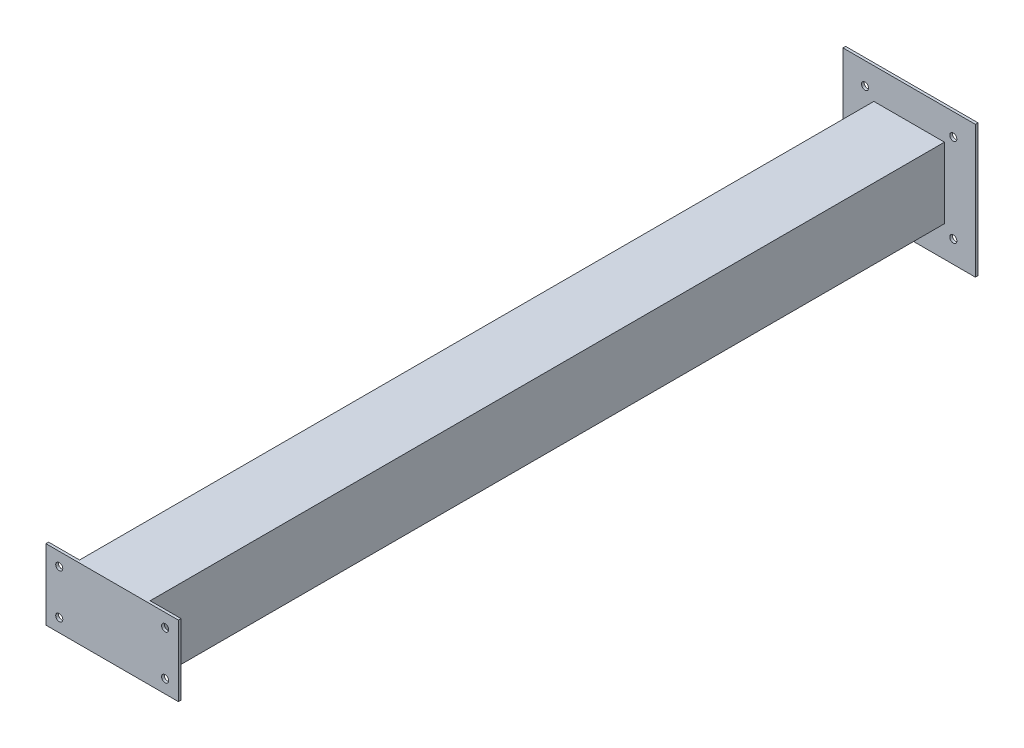
ISO-10303-21;
HEADER;
FILE_DESCRIPTION(('STEP AP214'),'2;1');
FILE_NAME('part.step','',(''),(''),'','','');
FILE_SCHEMA(('AUTOMOTIVE_DESIGN { 1 0 10303 214 1 1 1 1 }'));
ENDSEC;
DATA;
#1=APPLICATION_CONTEXT('core data for automotive mechanical design processes');
#2=APPLICATION_PROTOCOL_DEFINITION('international standard','automotive_design',2000,#1);
#3=PRODUCT_CONTEXT('',#1,'mechanical');
#4=PRODUCT('Part','Part','',(#3));
#5=PRODUCT_RELATED_PRODUCT_CATEGORY('part','',(#4));
#6=PRODUCT_DEFINITION_FORMATION('','',#4);
#7=PRODUCT_DEFINITION_CONTEXT('part definition',#1,'design');
#8=PRODUCT_DEFINITION('design','',#6,#7);
#9=PRODUCT_DEFINITION_SHAPE('','',#8);
#10=(LENGTH_UNIT() NAMED_UNIT(*) SI_UNIT(.MILLI.,.METRE.));
#11=(NAMED_UNIT(*) PLANE_ANGLE_UNIT() SI_UNIT($,.RADIAN.));
#12=(NAMED_UNIT(*) SI_UNIT($,.STERADIAN.) SOLID_ANGLE_UNIT());
#13=UNCERTAINTY_MEASURE_WITH_UNIT(LENGTH_MEASURE(1.E-05),#10,'distance_accuracy_value','');
#14=(GEOMETRIC_REPRESENTATION_CONTEXT(3) GLOBAL_UNCERTAINTY_ASSIGNED_CONTEXT((#13)) GLOBAL_UNIT_ASSIGNED_CONTEXT((#10,
#11,#12)) REPRESENTATION_CONTEXT('',''));
#15=CARTESIAN_POINT('',(0.,0.,0.));
#16=DIRECTION('',(0.,0.,1.));
#17=DIRECTION('',(1.,0.,0.));
#18=AXIS2_PLACEMENT_3D('',#15,#16,#17);
#19=CARTESIAN_POINT('',(40.,40.,900.));
#20=DIRECTION('',(-1.,0.,0.));
#21=DIRECTION('',(0.,0.,1.));
#22=AXIS2_PLACEMENT_3D('',#19,#20,#21);
#23=PLANE('',#22);
#24=DIRECTION('',(0.,0.,-1.));
#25=VECTOR('',#24,1.);
#26=CARTESIAN_POINT('',(40.,1.5,865.));
#27=LINE('',#26,#25);
#28=CARTESIAN_POINT('',(40.,1.5,900.));
#29=VERTEX_POINT('',#28);
#30=CARTESIAN_POINT('',(40.,1.5,865.));
#31=VERTEX_POINT('',#30);
#32=EDGE_CURVE('E187',#29,#31,#27,.T.);
#33=ORIENTED_EDGE('',*,*,#32,.T.);
#34=DIRECTION('',(0.,-1.,0.));
#35=VECTOR('',#34,1.);
#36=CARTESIAN_POINT('',(40.,1.5,865.));
#37=LINE('',#36,#35);
#38=CARTESIAN_POINT('',(40.,-1.5,865.));
#39=VERTEX_POINT('',#38);
#40=EDGE_CURVE('E696',#31,#39,#37,.T.);
#41=ORIENTED_EDGE('',*,*,#40,.T.);
#42=DIRECTION('',(0.,0.,-1.));
#43=VECTOR('',#42,1.);
#44=CARTESIAN_POINT('',(40.,-1.5,865.));
#45=LINE('',#44,#43);
#46=CARTESIAN_POINT('',(40.,-1.5,900.));
#47=VERTEX_POINT('',#46);
#48=EDGE_CURVE('E257',#47,#39,#45,.T.);
#49=ORIENTED_EDGE('',*,*,#48,.F.);
#50=DIRECTION('',(0.,1.,0.));
#51=VECTOR('',#50,1.);
#52=CARTESIAN_POINT('',(40.,40.,900.));
#53=LINE('',#52,#51);
#54=CARTESIAN_POINT('',(40.,-40.,900.));
#55=VERTEX_POINT('',#54);
#56=EDGE_CURVE('E208',#55,#47,#53,.T.);
#57=ORIENTED_EDGE('',*,*,#56,.F.);
#58=DIRECTION('',(0.,0.,-1.));
#59=VECTOR('',#58,1.);
#60=CARTESIAN_POINT('',(40.,-40.,900.));
#61=LINE('',#60,#59);
#62=CARTESIAN_POINT('',(40.,-40.,0.));
#63=VERTEX_POINT('',#62);
#64=EDGE_CURVE('E223',#55,#63,#61,.T.);
#65=ORIENTED_EDGE('',*,*,#64,.T.);
#66=DIRECTION('',(0.,1.,0.));
#67=VECTOR('',#66,1.);
#68=CARTESIAN_POINT('',(40.,40.,0.));
#69=LINE('',#68,#67);
#70=CARTESIAN_POINT('',(40.,40.,0.));
#71=VERTEX_POINT('',#70);
#72=EDGE_CURVE('E224',#63,#71,#69,.T.);
#73=ORIENTED_EDGE('',*,*,#72,.T.);
#74=DIRECTION('',(0.,0.,-1.));
#75=VECTOR('',#74,1.);
#76=CARTESIAN_POINT('',(40.,40.,900.));
#77=LINE('',#76,#75);
#78=CARTESIAN_POINT('',(40.,40.,900.));
#79=VERTEX_POINT('',#78);
#80=EDGE_CURVE('E11',#79,#71,#77,.T.);
#81=ORIENTED_EDGE('',*,*,#80,.F.);
#82=EDGE_CURVE('E201',#29,#79,#53,.T.);
#83=ORIENTED_EDGE('',*,*,#82,.F.);
#84=EDGE_LOOP('',(#33,#41,#49,#57,#65,#73,#81,#83));
#85=FACE_BOUND('',#84,.T.);
#86=ADVANCED_FACE('F37',(#85),#23,.F.);
#87=CARTESIAN_POINT('',(0.,0.,900.));
#88=DIRECTION('',(0.,0.,1.));
#89=DIRECTION('',(1.,0.,0.));
#90=AXIS2_PLACEMENT_3D('',#87,#88,#89);
#91=PLANE('',#90);
#92=CARTESIAN_POINT('',(60.,25.,900.));
#93=DIRECTION('',(0.,0.,1.));
#94=DIRECTION('',(1.,0.,0.));
#95=AXIS2_PLACEMENT_3D('',#92,#93,#94);
#96=CIRCLE('',#95,4.00000000000001);
#97=CARTESIAN_POINT('',(64.,25.,900.));
#98=VERTEX_POINT('',#97);
#99=EDGE_CURVE('E726',#98,#98,#96,.F.);
#100=ORIENTED_EDGE('',*,*,#99,.F.);
#101=EDGE_LOOP('',(#100));
#102=FACE_BOUND('',#101,.T.);
#103=DIRECTION('',(-1.,0.,0.));
#104=VECTOR('',#103,1.);
#105=CARTESIAN_POINT('',(40.,1.5,900.));
#106=LINE('',#105,#104);
#107=CARTESIAN_POINT('',(75.,1.5,900.));
#108=VERTEX_POINT('',#107);
#109=EDGE_CURVE('E190',#108,#29,#106,.T.);
#110=ORIENTED_EDGE('',*,*,#109,.T.);
#111=ORIENTED_EDGE('',*,*,#82,.T.);
#112=DIRECTION('',(-1.,0.,0.));
#113=VECTOR('',#112,1.);
#114=CARTESIAN_POINT('',(75.,40.,900.));
#115=LINE('',#114,#113);
#116=CARTESIAN_POINT('',(75.,40.,900.));
#117=VERTEX_POINT('',#116);
#118=EDGE_CURVE('E276',#117,#79,#115,.T.);
#119=ORIENTED_EDGE('',*,*,#118,.F.);
#120=DIRECTION('',(0.,1.,0.));
#121=VECTOR('',#120,1.);
#122=CARTESIAN_POINT('',(75.,-40.,900.));
#123=LINE('',#122,#121);
#124=EDGE_CURVE('E203',#108,#117,#123,.T.);
#125=ORIENTED_EDGE('',*,*,#124,.F.);
#126=EDGE_LOOP('',(#110,#111,#119,#125));
#127=FACE_BOUND('',#126,.T.);
#128=ADVANCED_FACE('F199',(#102,#127),#91,.F.);
#129=CARTESIAN_POINT('',(-40.,40.,900.));
#130=DIRECTION('',(1.,0.,0.));
#131=DIRECTION('',(0.,1.,0.));
#132=AXIS2_PLACEMENT_3D('',#129,#130,#131);
#133=PLANE('',#132);
#134=DIRECTION('',(0.,0.,-1.));
#135=VECTOR('',#134,1.);
#136=CARTESIAN_POINT('',(-40.,1.5,865.));
#137=LINE('',#136,#135);
#138=CARTESIAN_POINT('',(-40.,1.5,900.));
#139=VERTEX_POINT('',#138);
#140=CARTESIAN_POINT('',(-40.,1.5,865.));
#141=VERTEX_POINT('',#140);
#142=EDGE_CURVE('E704',#139,#141,#137,.T.);
#143=ORIENTED_EDGE('',*,*,#142,.F.);
#144=DIRECTION('',(0.,-1.,0.));
#145=VECTOR('',#144,1.);
#146=CARTESIAN_POINT('',(-40.,40.,900.));
#147=LINE('',#146,#145);
#148=CARTESIAN_POINT('',(-40.,40.,900.));
#149=VERTEX_POINT('',#148);
#150=EDGE_CURVE('E220',#149,#139,#147,.T.);
#151=ORIENTED_EDGE('',*,*,#150,.F.);
#152=DIRECTION('',(0.,0.,-1.));
#153=VECTOR('',#152,1.);
#154=CARTESIAN_POINT('',(-40.,40.,900.));
#155=LINE('',#154,#153);
#156=CARTESIAN_POINT('',(-40.,40.,0.));
#157=VERTEX_POINT('',#156);
#158=EDGE_CURVE('E45',#149,#157,#155,.T.);
#159=ORIENTED_EDGE('',*,*,#158,.T.);
#160=DIRECTION('',(0.,-1.,0.));
#161=VECTOR('',#160,1.);
#162=CARTESIAN_POINT('',(-40.,40.,0.));
#163=LINE('',#162,#161);
#164=CARTESIAN_POINT('',(-40.,-40.,0.));
#165=VERTEX_POINT('',#164);
#166=EDGE_CURVE('E214',#157,#165,#163,.T.);
#167=ORIENTED_EDGE('',*,*,#166,.T.);
#168=DIRECTION('',(0.,0.,-1.));
#169=VECTOR('',#168,1.);
#170=CARTESIAN_POINT('',(-40.,-40.,900.));
#171=LINE('',#170,#169);
#172=CARTESIAN_POINT('',(-40.,-40.,900.));
#173=VERTEX_POINT('',#172);
#174=EDGE_CURVE('E234',#173,#165,#171,.T.);
#175=ORIENTED_EDGE('',*,*,#174,.F.);
#176=CARTESIAN_POINT('',(-40.,-1.5,900.));
#177=VERTEX_POINT('',#176);
#178=EDGE_CURVE('E212',#177,#173,#147,.T.);
#179=ORIENTED_EDGE('',*,*,#178,.F.);
#180=DIRECTION('',(0.,0.,-1.));
#181=VECTOR('',#180,1.);
#182=CARTESIAN_POINT('',(-40.,-1.5,865.));
#183=LINE('',#182,#181);
#184=CARTESIAN_POINT('',(-40.,-1.5,865.));
#185=VERTEX_POINT('',#184);
#186=EDGE_CURVE('E60',#177,#185,#183,.T.);
#187=ORIENTED_EDGE('',*,*,#186,.T.);
#188=DIRECTION('',(0.,-1.,0.));
#189=VECTOR('',#188,1.);
#190=CARTESIAN_POINT('',(-40.,1.5,865.));
#191=LINE('',#190,#189);
#192=EDGE_CURVE('E719',#141,#185,#191,.T.);
#193=ORIENTED_EDGE('',*,*,#192,.F.);
#194=EDGE_LOOP('',(#143,#151,#159,#167,#175,#179,#187,#193));
#195=FACE_BOUND('',#194,.T.);
#196=ADVANCED_FACE('F240',(#195),#133,.F.);
#197=CARTESIAN_POINT('',(-60.,25.,900.));
#198=DIRECTION('',(0.,0.,1.));
#199=DIRECTION('',(1.,0.,0.));
#200=AXIS2_PLACEMENT_3D('',#197,#198,#199);
#201=CIRCLE('',#200,4.00000000000001);
#202=CARTESIAN_POINT('',(-56.,25.,900.));
#203=VERTEX_POINT('',#202);
#204=EDGE_CURVE('E743',#203,#203,#201,.F.);
#205=ORIENTED_EDGE('',*,*,#204,.F.);
#206=EDGE_LOOP('',(#205));
#207=FACE_BOUND('',#206,.T.);
#208=DIRECTION('',(1.,0.,0.));
#209=VECTOR('',#208,1.);
#210=CARTESIAN_POINT('',(-40.,1.5,900.));
#211=LINE('',#210,#209);
#212=CARTESIAN_POINT('',(-75.,1.5,900.));
#213=VERTEX_POINT('',#212);
#214=EDGE_CURVE('E710',#213,#139,#211,.T.);
#215=ORIENTED_EDGE('',*,*,#214,.F.);
#216=DIRECTION('',(0.,-1.,0.));
#217=VECTOR('',#216,1.);
#218=CARTESIAN_POINT('',(-75.,-40.,900.));
#219=LINE('',#218,#217);
#220=CARTESIAN_POINT('',(-75.,40.,900.));
#221=VERTEX_POINT('',#220);
#222=EDGE_CURVE('E268',#221,#213,#219,.T.);
#223=ORIENTED_EDGE('',*,*,#222,.F.);
#224=EDGE_CURVE('E246',#149,#221,#115,.T.);
#225=ORIENTED_EDGE('',*,*,#224,.F.);
#226=ORIENTED_EDGE('',*,*,#150,.T.);
#227=EDGE_LOOP('',(#215,#223,#225,#226));
#228=FACE_BOUND('',#227,.T.);
#229=ADVANCED_FACE('F403',(#207,#228),#91,.F.);
#230=CARTESIAN_POINT('',(-40.,40.,900.));
#231=DIRECTION('',(0.,-1.,0.));
#232=DIRECTION('',(0.,0.,-1.));
#233=AXIS2_PLACEMENT_3D('',#230,#231,#232);
#234=PLANE('',#233);
#235=DIRECTION('',(-1.,0.,0.));
#236=VECTOR('',#235,1.);
#237=CARTESIAN_POINT('',(-40.,40.,0.));
#238=LINE('',#237,#236);
#239=EDGE_CURVE('E226',#71,#157,#238,.T.);
#240=ORIENTED_EDGE('',*,*,#239,.T.);
#241=ORIENTED_EDGE('',*,*,#158,.F.);
#242=ORIENTED_EDGE('',*,*,#224,.T.);
#243=DIRECTION('',(0.,0.,-1.));
#244=VECTOR('',#243,1.);
#245=CARTESIAN_POINT('',(-75.,40.,903.));
#246=LINE('',#245,#244);
#247=CARTESIAN_POINT('',(-75.,40.,903.));
#248=VERTEX_POINT('',#247);
#249=EDGE_CURVE('E279',#248,#221,#246,.T.);
#250=ORIENTED_EDGE('',*,*,#249,.F.);
#251=DIRECTION('',(-1.,0.,0.));
#252=VECTOR('',#251,1.);
#253=CARTESIAN_POINT('',(75.,40.,903.));
#254=LINE('',#253,#252);
#255=CARTESIAN_POINT('',(75.,40.,903.));
#256=VERTEX_POINT('',#255);
#257=EDGE_CURVE('E282',#256,#248,#254,.T.);
#258=ORIENTED_EDGE('',*,*,#257,.F.);
#259=DIRECTION('',(0.,0.,-1.));
#260=VECTOR('',#259,1.);
#261=CARTESIAN_POINT('',(75.,40.,903.));
#262=LINE('',#261,#260);
#263=EDGE_CURVE('E281',#256,#117,#262,.T.);
#264=ORIENTED_EDGE('',*,*,#263,.T.);
#265=ORIENTED_EDGE('',*,*,#118,.T.);
#266=ORIENTED_EDGE('',*,*,#80,.T.);
#267=EDGE_LOOP('',(#240,#241,#242,#250,#258,#264,#265,#266));
#268=FACE_BOUND('',#267,.T.);
#269=ADVANCED_FACE('F244',(#268),#234,.F.);
#270=CARTESIAN_POINT('',(-40.,-40.,900.));
#271=DIRECTION('',(0.,1.,0.));
#272=DIRECTION('',(0.,0.,1.));
#273=AXIS2_PLACEMENT_3D('',#270,#271,#272);
#274=PLANE('',#273);
#275=DIRECTION('',(1.,0.,0.));
#276=VECTOR('',#275,1.);
#277=CARTESIAN_POINT('',(-40.,-40.,0.));
#278=LINE('',#277,#276);
#279=EDGE_CURVE('E209',#165,#63,#278,.T.);
#280=ORIENTED_EDGE('',*,*,#279,.T.);
#281=ORIENTED_EDGE('',*,*,#64,.F.);
#282=DIRECTION('',(1.,0.,0.));
#283=VECTOR('',#282,1.);
#284=CARTESIAN_POINT('',(75.,-40.,900.));
#285=LINE('',#284,#283);
#286=CARTESIAN_POINT('',(75.,-40.,900.));
#287=VERTEX_POINT('',#286);
#288=EDGE_CURVE('E261',#55,#287,#285,.T.);
#289=ORIENTED_EDGE('',*,*,#288,.T.);
#290=DIRECTION('',(0.,0.,-1.));
#291=VECTOR('',#290,1.);
#292=CARTESIAN_POINT('',(75.,-40.,903.));
#293=LINE('',#292,#291);
#294=CARTESIAN_POINT('',(75.,-40.,903.));
#295=VERTEX_POINT('',#294);
#296=EDGE_CURVE('E285',#295,#287,#293,.T.);
#297=ORIENTED_EDGE('',*,*,#296,.F.);
#298=DIRECTION('',(1.,0.,0.));
#299=VECTOR('',#298,1.);
#300=CARTESIAN_POINT('',(75.,-40.,903.));
#301=LINE('',#300,#299);
#302=CARTESIAN_POINT('',(-75.,-40.,903.));
#303=VERTEX_POINT('',#302);
#304=EDGE_CURVE('E748',#303,#295,#301,.T.);
#305=ORIENTED_EDGE('',*,*,#304,.F.);
#306=DIRECTION('',(0.,0.,-1.));
#307=VECTOR('',#306,1.);
#308=CARTESIAN_POINT('',(-75.,-40.,903.));
#309=LINE('',#308,#307);
#310=CARTESIAN_POINT('',(-75.,-40.,900.));
#311=VERTEX_POINT('',#310);
#312=EDGE_CURVE('E287',#303,#311,#309,.T.);
#313=ORIENTED_EDGE('',*,*,#312,.T.);
#314=EDGE_CURVE('E267',#311,#173,#285,.T.);
#315=ORIENTED_EDGE('',*,*,#314,.T.);
#316=ORIENTED_EDGE('',*,*,#174,.T.);
#317=EDGE_LOOP('',(#280,#281,#289,#297,#305,#313,#315,#316));
#318=FACE_BOUND('',#317,.T.);
#319=ADVANCED_FACE('F252',(#318),#274,.F.);
#320=CARTESIAN_POINT('',(50.,-50.,-3.));
#321=DIRECTION('',(0.,0.,1.));
#322=DIRECTION('',(1.,0.,0.));
#323=AXIS2_PLACEMENT_3D('',#320,#321,#322);
#324=CYLINDRICAL_SURFACE('',#323,4.00000000000001);
#325=CARTESIAN_POINT('',(50.,-50.,-3.));
#326=DIRECTION('',(0.,0.,-1.));
#327=DIRECTION('',(-1.,0.,0.));
#328=AXIS2_PLACEMENT_3D('',#325,#326,#327);
#329=CIRCLE('',#328,4.00000000000001);
#330=CARTESIAN_POINT('',(46.,-50.,-3.));
#331=VERTEX_POINT('',#330);
#332=EDGE_CURVE('E291',#331,#331,#329,.T.);
#333=ORIENTED_EDGE('',*,*,#332,.T.);
#334=EDGE_LOOP('',(#333));
#335=FACE_BOUND('',#334,.T.);
#336=CARTESIAN_POINT('',(50.,-50.,0.));
#337=DIRECTION('',(0.,0.,-1.));
#338=DIRECTION('',(-1.,0.,0.));
#339=AXIS2_PLACEMENT_3D('',#336,#337,#338);
#340=CIRCLE('',#339,4.00000000000001);
#341=CARTESIAN_POINT('',(46.,-50.,0.));
#342=VERTEX_POINT('',#341);
#343=EDGE_CURVE('E290',#342,#342,#340,.T.);
#344=ORIENTED_EDGE('',*,*,#343,.F.);
#345=EDGE_LOOP('',(#344));
#346=FACE_BOUND('',#345,.T.);
#347=ADVANCED_FACE('F462',(#335,#346),#324,.F.);
#348=CARTESIAN_POINT('',(-50.,-50.,-3.));
#349=DIRECTION('',(0.,0.,1.));
#350=DIRECTION('',(1.,0.,0.));
#351=AXIS2_PLACEMENT_3D('',#348,#349,#350);
#352=CYLINDRICAL_SURFACE('',#351,4.);
#353=CARTESIAN_POINT('',(-50.,-50.,-3.));
#354=DIRECTION('',(0.,0.,-1.));
#355=DIRECTION('',(1.,0.,0.));
#356=AXIS2_PLACEMENT_3D('',#353,#354,#355);
#357=CIRCLE('',#356,4.);
#358=CARTESIAN_POINT('',(-46.,-50.,-3.));
#359=VERTEX_POINT('',#358);
#360=EDGE_CURVE('E297',#359,#359,#357,.T.);
#361=ORIENTED_EDGE('',*,*,#360,.T.);
#362=EDGE_LOOP('',(#361));
#363=FACE_BOUND('',#362,.T.);
#364=CARTESIAN_POINT('',(-50.,-50.,0.));
#365=DIRECTION('',(0.,0.,-1.));
#366=DIRECTION('',(1.,0.,0.));
#367=AXIS2_PLACEMENT_3D('',#364,#365,#366);
#368=CIRCLE('',#367,4.);
#369=CARTESIAN_POINT('',(-46.,-50.,0.));
#370=VERTEX_POINT('',#369);
#371=EDGE_CURVE('E294',#370,#370,#368,.T.);
#372=ORIENTED_EDGE('',*,*,#371,.F.);
#373=EDGE_LOOP('',(#372));
#374=FACE_BOUND('',#373,.T.);
#375=ADVANCED_FACE('F470',(#363,#374),#352,.F.);
#376=CARTESIAN_POINT('',(50.,50.,-3.));
#377=DIRECTION('',(0.,0.,1.));
#378=DIRECTION('',(1.,0.,0.));
#379=AXIS2_PLACEMENT_3D('',#376,#377,#378);
#380=CYLINDRICAL_SURFACE('',#379,4.);
#381=CARTESIAN_POINT('',(50.,50.,-3.));
#382=DIRECTION('',(0.,0.,-1.));
#383=DIRECTION('',(1.,0.,0.));
#384=AXIS2_PLACEMENT_3D('',#381,#382,#383);
#385=CIRCLE('',#384,4.);
#386=CARTESIAN_POINT('',(54.,50.,-3.));
#387=VERTEX_POINT('',#386);
#388=EDGE_CURVE('E303',#387,#387,#385,.T.);
#389=ORIENTED_EDGE('',*,*,#388,.T.);
#390=EDGE_LOOP('',(#389));
#391=FACE_BOUND('',#390,.T.);
#392=CARTESIAN_POINT('',(50.,50.,0.));
#393=DIRECTION('',(0.,0.,-1.));
#394=DIRECTION('',(1.,0.,0.));
#395=AXIS2_PLACEMENT_3D('',#392,#393,#394);
#396=CIRCLE('',#395,4.);
#397=CARTESIAN_POINT('',(54.,50.,0.));
#398=VERTEX_POINT('',#397);
#399=EDGE_CURVE('E300',#398,#398,#396,.T.);
#400=ORIENTED_EDGE('',*,*,#399,.F.);
#401=EDGE_LOOP('',(#400));
#402=FACE_BOUND('',#401,.T.);
#403=ADVANCED_FACE('F478',(#391,#402),#380,.F.);
#404=CARTESIAN_POINT('',(-50.,50.,-3.));
#405=DIRECTION('',(0.,0.,1.));
#406=DIRECTION('',(1.,0.,0.));
#407=AXIS2_PLACEMENT_3D('',#404,#405,#406);
#408=CYLINDRICAL_SURFACE('',#407,4.);
#409=CARTESIAN_POINT('',(-50.,50.,-3.));
#410=DIRECTION('',(0.,0.,-1.));
#411=DIRECTION('',(-1.,0.,0.));
#412=AXIS2_PLACEMENT_3D('',#409,#410,#411);
#413=CIRCLE('',#412,4.);
#414=CARTESIAN_POINT('',(-54.,50.,-3.));
#415=VERTEX_POINT('',#414);
#416=EDGE_CURVE('E309',#415,#415,#413,.T.);
#417=ORIENTED_EDGE('',*,*,#416,.T.);
#418=EDGE_LOOP('',(#417));
#419=FACE_BOUND('',#418,.T.);
#420=CARTESIAN_POINT('',(-50.,50.,0.));
#421=DIRECTION('',(0.,0.,-1.));
#422=DIRECTION('',(-1.,0.,0.));
#423=AXIS2_PLACEMENT_3D('',#420,#421,#422);
#424=CIRCLE('',#423,4.);
#425=CARTESIAN_POINT('',(-54.,50.,0.));
#426=VERTEX_POINT('',#425);
#427=EDGE_CURVE('E306',#426,#426,#424,.T.);
#428=ORIENTED_EDGE('',*,*,#427,.F.);
#429=EDGE_LOOP('',(#428));
#430=FACE_BOUND('',#429,.T.);
#431=ADVANCED_FACE('F486',(#419,#430),#408,.F.);
#432=CARTESIAN_POINT('',(-75.,75.,-3.));
#433=DIRECTION('',(0.,-1.,0.));
#434=DIRECTION('',(0.,0.,-1.));
#435=AXIS2_PLACEMENT_3D('',#432,#433,#434);
#436=PLANE('',#435);
#437=DIRECTION('',(1.,0.,0.));
#438=VECTOR('',#437,1.);
#439=CARTESIAN_POINT('',(-75.,75.,0.));
#440=LINE('',#439,#438);
#441=CARTESIAN_POINT('',(-75.,75.,0.));
#442=VERTEX_POINT('',#441);
#443=CARTESIAN_POINT('',(75.,75.,0.));
#444=VERTEX_POINT('',#443);
#445=EDGE_CURVE('E319',#442,#444,#440,.T.);
#446=ORIENTED_EDGE('',*,*,#445,.T.);
#447=DIRECTION('',(0.,0.,1.));
#448=VECTOR('',#447,1.);
#449=CARTESIAN_POINT('',(75.,75.,-3.));
#450=LINE('',#449,#448);
#451=CARTESIAN_POINT('',(75.,75.,-3.));
#452=VERTEX_POINT('',#451);
#453=EDGE_CURVE('E325',#452,#444,#450,.T.);
#454=ORIENTED_EDGE('',*,*,#453,.F.);
#455=DIRECTION('',(1.,0.,0.));
#456=VECTOR('',#455,1.);
#457=CARTESIAN_POINT('',(-75.,75.,-3.));
#458=LINE('',#457,#456);
#459=CARTESIAN_POINT('',(-75.,75.,-3.));
#460=VERTEX_POINT('',#459);
#461=EDGE_CURVE('E323',#460,#452,#458,.T.);
#462=ORIENTED_EDGE('',*,*,#461,.F.);
#463=DIRECTION('',(0.,0.,1.));
#464=VECTOR('',#463,1.);
#465=CARTESIAN_POINT('',(-75.,75.,-3.));
#466=LINE('',#465,#464);
#467=EDGE_CURVE('E335',#460,#442,#466,.T.);
#468=ORIENTED_EDGE('',*,*,#467,.T.);
#469=EDGE_LOOP('',(#446,#454,#462,#468));
#470=FACE_BOUND('',#469,.T.);
#471=ADVANCED_FACE('F494',(#470),#436,.F.);
#472=CARTESIAN_POINT('',(-75.,-75.,-3.));
#473=DIRECTION('',(1.,0.,0.));
#474=DIRECTION('',(0.,0.,-1.));
#475=AXIS2_PLACEMENT_3D('',#472,#473,#474);
#476=PLANE('',#475);
#477=DIRECTION('',(0.,1.,0.));
#478=VECTOR('',#477,1.);
#479=CARTESIAN_POINT('',(-75.,-75.,0.));
#480=LINE('',#479,#478);
#481=CARTESIAN_POINT('',(-75.,-75.,0.));
#482=VERTEX_POINT('',#481);
#483=EDGE_CURVE('E330',#482,#442,#480,.T.);
#484=ORIENTED_EDGE('',*,*,#483,.T.);
#485=ORIENTED_EDGE('',*,*,#467,.F.);
#486=DIRECTION('',(0.,1.,0.));
#487=VECTOR('',#486,1.);
#488=CARTESIAN_POINT('',(-75.,-75.,-3.));
#489=LINE('',#488,#487);
#490=CARTESIAN_POINT('',(-75.,-75.,-3.));
#491=VERTEX_POINT('',#490);
#492=EDGE_CURVE('E321',#491,#460,#489,.T.);
#493=ORIENTED_EDGE('',*,*,#492,.F.);
#494=DIRECTION('',(0.,0.,1.));
#495=VECTOR('',#494,1.);
#496=CARTESIAN_POINT('',(-75.,-75.,-3.));
#497=LINE('',#496,#495);
#498=EDGE_CURVE('E338',#491,#482,#497,.T.);
#499=ORIENTED_EDGE('',*,*,#498,.T.);
#500=EDGE_LOOP('',(#484,#485,#493,#499));
#501=FACE_BOUND('',#500,.T.);
#502=ADVANCED_FACE('F502',(#501),#476,.F.);
#503=CARTESIAN_POINT('',(-75.,-75.,-3.));
#504=DIRECTION('',(0.,1.,0.));
#505=DIRECTION('',(-1.,0.,0.));
#506=AXIS2_PLACEMENT_3D('',#503,#504,#505);
#507=PLANE('',#506);
#508=DIRECTION('',(-1.,0.,0.));
#509=VECTOR('',#508,1.);
#510=CARTESIAN_POINT('',(-75.,-75.,0.));
#511=LINE('',#510,#509);
#512=CARTESIAN_POINT('',(75.,-75.,0.));
#513=VERTEX_POINT('',#512);
#514=EDGE_CURVE('E328',#513,#482,#511,.T.);
#515=ORIENTED_EDGE('',*,*,#514,.T.);
#516=ORIENTED_EDGE('',*,*,#498,.F.);
#517=DIRECTION('',(-1.,0.,0.));
#518=VECTOR('',#517,1.);
#519=CARTESIAN_POINT('',(-75.,-75.,-3.));
#520=LINE('',#519,#518);
#521=CARTESIAN_POINT('',(75.,-75.,-3.));
#522=VERTEX_POINT('',#521);
#523=EDGE_CURVE('E318',#522,#491,#520,.T.);
#524=ORIENTED_EDGE('',*,*,#523,.F.);
#525=DIRECTION('',(0.,0.,1.));
#526=VECTOR('',#525,1.);
#527=CARTESIAN_POINT('',(75.,-75.,-3.));
#528=LINE('',#527,#526);
#529=EDGE_CURVE('E341',#522,#513,#528,.T.);
#530=ORIENTED_EDGE('',*,*,#529,.T.);
#531=EDGE_LOOP('',(#515,#516,#524,#530));
#532=FACE_BOUND('',#531,.T.);
#533=ADVANCED_FACE('F425',(#532),#507,.F.);
#534=CARTESIAN_POINT('',(75.,-75.,-3.));
#535=DIRECTION('',(-1.,0.,0.));
#536=DIRECTION('',(0.,0.,1.));
#537=AXIS2_PLACEMENT_3D('',#534,#535,#536);
#538=PLANE('',#537);
#539=DIRECTION('',(0.,-1.,0.));
#540=VECTOR('',#539,1.);
#541=CARTESIAN_POINT('',(75.,-75.,0.));
#542=LINE('',#541,#540);
#543=EDGE_CURVE('E312',#444,#513,#542,.T.);
#544=ORIENTED_EDGE('',*,*,#543,.T.);
#545=ORIENTED_EDGE('',*,*,#529,.F.);
#546=DIRECTION('',(0.,-1.,0.));
#547=VECTOR('',#546,1.);
#548=CARTESIAN_POINT('',(75.,-75.,-3.));
#549=LINE('',#548,#547);
#550=EDGE_CURVE('E315',#452,#522,#549,.T.);
#551=ORIENTED_EDGE('',*,*,#550,.F.);
#552=ORIENTED_EDGE('',*,*,#453,.T.);
#553=EDGE_LOOP('',(#544,#545,#551,#552));
#554=FACE_BOUND('',#553,.T.);
#555=ADVANCED_FACE('F418',(#554),#538,.F.);
#556=CARTESIAN_POINT('',(0.,0.,0.));
#557=DIRECTION('',(0.,0.,-1.));
#558=DIRECTION('',(-1.,0.,0.));
#559=AXIS2_PLACEMENT_3D('',#556,#557,#558);
#560=PLANE('',#559);
#561=ORIENTED_EDGE('',*,*,#72,.F.);
#562=ORIENTED_EDGE('',*,*,#279,.F.);
#563=ORIENTED_EDGE('',*,*,#166,.F.);
#564=ORIENTED_EDGE('',*,*,#239,.F.);
#565=EDGE_LOOP('',(#561,#562,#563,#564));
#566=FACE_BOUND('',#565,.T.);
#567=ORIENTED_EDGE('',*,*,#543,.F.);
#568=ORIENTED_EDGE('',*,*,#445,.F.);
#569=ORIENTED_EDGE('',*,*,#483,.F.);
#570=ORIENTED_EDGE('',*,*,#514,.F.);
#571=EDGE_LOOP('',(#567,#568,#569,#570));
#572=FACE_BOUND('',#571,.T.);
#573=ORIENTED_EDGE('',*,*,#427,.T.);
#574=EDGE_LOOP('',(#573));
#575=FACE_BOUND('',#574,.T.);
#576=ORIENTED_EDGE('',*,*,#399,.T.);
#577=EDGE_LOOP('',(#576));
#578=FACE_BOUND('',#577,.T.);
#579=ORIENTED_EDGE('',*,*,#371,.T.);
#580=EDGE_LOOP('',(#579));
#581=FACE_BOUND('',#580,.T.);
#582=ORIENTED_EDGE('',*,*,#343,.T.);
#583=EDGE_LOOP('',(#582));
#584=FACE_BOUND('',#583,.T.);
#585=ADVANCED_FACE('F249',(#566,#572,#575,#578,#581,#584),#560,.F.);
#586=CARTESIAN_POINT('',(0.,0.,-3.));
#587=DIRECTION('',(0.,0.,-1.));
#588=DIRECTION('',(-1.,0.,0.));
#589=AXIS2_PLACEMENT_3D('',#586,#587,#588);
#590=PLANE('',#589);
#591=ORIENTED_EDGE('',*,*,#360,.F.);
#592=EDGE_LOOP('',(#591));
#593=FACE_BOUND('',#592,.T.);
#594=ORIENTED_EDGE('',*,*,#416,.F.);
#595=EDGE_LOOP('',(#594));
#596=FACE_BOUND('',#595,.T.);
#597=ORIENTED_EDGE('',*,*,#550,.T.);
#598=ORIENTED_EDGE('',*,*,#523,.T.);
#599=ORIENTED_EDGE('',*,*,#492,.T.);
#600=ORIENTED_EDGE('',*,*,#461,.T.);
#601=EDGE_LOOP('',(#597,#598,#599,#600));
#602=FACE_BOUND('',#601,.T.);
#603=ORIENTED_EDGE('',*,*,#388,.F.);
#604=EDGE_LOOP('',(#603));
#605=FACE_BOUND('',#604,.T.);
#606=ORIENTED_EDGE('',*,*,#332,.F.);
#607=EDGE_LOOP('',(#606));
#608=FACE_BOUND('',#607,.T.);
#609=ADVANCED_FACE('F417',(#593,#596,#602,#605,#608),#590,.T.);
#610=CARTESIAN_POINT('',(0.,0.,903.));
#611=DIRECTION('',(0.,0.,1.));
#612=DIRECTION('',(1.,0.,0.));
#613=AXIS2_PLACEMENT_3D('',#610,#611,#612);
#614=PLANE('',#613);
#615=CARTESIAN_POINT('',(-60.,-25.,903.));
#616=DIRECTION('',(0.,0.,1.));
#617=DIRECTION('',(-1.,0.,0.));
#618=AXIS2_PLACEMENT_3D('',#615,#616,#617);
#619=CIRCLE('',#618,4.00000000000001);
#620=CARTESIAN_POINT('',(-64.,-25.,903.));
#621=VERTEX_POINT('',#620);
#622=EDGE_CURVE('E722',#621,#621,#619,.T.);
#623=ORIENTED_EDGE('',*,*,#622,.F.);
#624=EDGE_LOOP('',(#623));
#625=FACE_BOUND('',#624,.T.);
#626=CARTESIAN_POINT('',(60.,-25.,903.));
#627=DIRECTION('',(0.,0.,1.));
#628=DIRECTION('',(1.,0.,0.));
#629=AXIS2_PLACEMENT_3D('',#626,#627,#628);
#630=CIRCLE('',#629,4.00000000000001);
#631=CARTESIAN_POINT('',(64.,-25.,903.));
#632=VERTEX_POINT('',#631);
#633=EDGE_CURVE('E731',#632,#632,#630,.T.);
#634=ORIENTED_EDGE('',*,*,#633,.F.);
#635=EDGE_LOOP('',(#634));
#636=FACE_BOUND('',#635,.T.);
#637=CARTESIAN_POINT('',(60.,25.,903.));
#638=DIRECTION('',(0.,0.,1.));
#639=DIRECTION('',(-1.,0.,0.));
#640=AXIS2_PLACEMENT_3D('',#637,#638,#639);
#641=CIRCLE('',#640,4.00000000000001);
#642=CARTESIAN_POINT('',(56.,25.,903.));
#643=VERTEX_POINT('',#642);
#644=EDGE_CURVE('E723',#643,#643,#641,.T.);
#645=ORIENTED_EDGE('',*,*,#644,.F.);
#646=EDGE_LOOP('',(#645));
#647=FACE_BOUND('',#646,.T.);
#648=CARTESIAN_POINT('',(-60.,25.,903.));
#649=DIRECTION('',(0.,0.,1.));
#650=DIRECTION('',(1.,0.,0.));
#651=AXIS2_PLACEMENT_3D('',#648,#649,#650);
#652=CIRCLE('',#651,4.00000000000001);
#653=CARTESIAN_POINT('',(-56.,25.,903.));
#654=VERTEX_POINT('',#653);
#655=EDGE_CURVE('E730',#654,#654,#652,.T.);
#656=ORIENTED_EDGE('',*,*,#655,.F.);
#657=EDGE_LOOP('',(#656));
#658=FACE_BOUND('',#657,.T.);
#659=DIRECTION('',(0.,-1.,0.));
#660=VECTOR('',#659,1.);
#661=CARTESIAN_POINT('',(-75.,-40.,903.));
#662=LINE('',#661,#660);
#663=EDGE_CURVE('E278',#248,#303,#662,.T.);
#664=ORIENTED_EDGE('',*,*,#663,.T.);
#665=ORIENTED_EDGE('',*,*,#304,.T.);
#666=DIRECTION('',(0.,1.,0.));
#667=VECTOR('',#666,1.);
#668=CARTESIAN_POINT('',(75.,-40.,903.));
#669=LINE('',#668,#667);
#670=EDGE_CURVE('E750',#295,#256,#669,.T.);
#671=ORIENTED_EDGE('',*,*,#670,.T.);
#672=ORIENTED_EDGE('',*,*,#257,.T.);
#673=EDGE_LOOP('',(#664,#665,#671,#672));
#674=FACE_BOUND('',#673,.T.);
#675=ADVANCED_FACE('F423',(#625,#636,#647,#658,#674),#614,.T.);
#676=CARTESIAN_POINT('',(75.,-40.,903.));
#677=DIRECTION('',(-1.,0.,0.));
#678=DIRECTION('',(0.,0.,1.));
#679=AXIS2_PLACEMENT_3D('',#676,#677,#678);
#680=PLANE('',#679);
#681=CARTESIAN_POINT('',(75.,-1.5,900.));
#682=VERTEX_POINT('',#681);
#683=EDGE_CURVE('E264',#287,#682,#123,.T.);
#684=ORIENTED_EDGE('',*,*,#683,.T.);
#685=DIRECTION('',(0.,-1.,0.));
#686=VECTOR('',#685,1.);
#687=CARTESIAN_POINT('',(75.,1.5,900.));
#688=LINE('',#687,#686);
#689=EDGE_CURVE('E697',#108,#682,#688,.T.);
#690=ORIENTED_EDGE('',*,*,#689,.F.);
#691=ORIENTED_EDGE('',*,*,#124,.T.);
#692=ORIENTED_EDGE('',*,*,#263,.F.);
#693=ORIENTED_EDGE('',*,*,#670,.F.);
#694=ORIENTED_EDGE('',*,*,#296,.T.);
#695=EDGE_LOOP('',(#684,#690,#691,#692,#693,#694));
#696=FACE_BOUND('',#695,.T.);
#697=ADVANCED_FACE('F556',(#696),#680,.F.);
#698=CARTESIAN_POINT('',(-75.,-40.,903.));
#699=DIRECTION('',(1.,0.,0.));
#700=DIRECTION('',(0.,0.,-1.));
#701=AXIS2_PLACEMENT_3D('',#698,#699,#700);
#702=PLANE('',#701);
#703=ORIENTED_EDGE('',*,*,#222,.T.);
#704=DIRECTION('',(0.,-1.,0.));
#705=VECTOR('',#704,1.);
#706=CARTESIAN_POINT('',(-75.,1.5,900.));
#707=LINE('',#706,#705);
#708=CARTESIAN_POINT('',(-75.,-1.5,900.));
#709=VERTEX_POINT('',#708);
#710=EDGE_CURVE('E712',#213,#709,#707,.T.);
#711=ORIENTED_EDGE('',*,*,#710,.T.);
#712=EDGE_CURVE('E271',#709,#311,#219,.T.);
#713=ORIENTED_EDGE('',*,*,#712,.T.);
#714=ORIENTED_EDGE('',*,*,#312,.F.);
#715=ORIENTED_EDGE('',*,*,#663,.F.);
#716=ORIENTED_EDGE('',*,*,#249,.T.);
#717=EDGE_LOOP('',(#703,#711,#713,#714,#715,#716));
#718=FACE_BOUND('',#717,.T.);
#719=ADVANCED_FACE('F405',(#718),#702,.F.);
#720=CARTESIAN_POINT('',(-60.,-25.,900.));
#721=DIRECTION('',(0.,0.,1.));
#722=DIRECTION('',(1.,0.,0.));
#723=AXIS2_PLACEMENT_3D('',#720,#721,#722);
#724=CIRCLE('',#723,4.00000000000001);
#725=CARTESIAN_POINT('',(-56.,-25.,900.));
#726=VERTEX_POINT('',#725);
#727=EDGE_CURVE('E734',#726,#726,#724,.F.);
#728=ORIENTED_EDGE('',*,*,#727,.F.);
#729=EDGE_LOOP('',(#728));
#730=FACE_BOUND('',#729,.T.);
#731=ORIENTED_EDGE('',*,*,#712,.F.);
#732=DIRECTION('',(1.,0.,0.));
#733=VECTOR('',#732,1.);
#734=CARTESIAN_POINT('',(-40.,-1.5,900.));
#735=LINE('',#734,#733);
#736=EDGE_CURVE('E708',#709,#177,#735,.T.);
#737=ORIENTED_EDGE('',*,*,#736,.T.);
#738=ORIENTED_EDGE('',*,*,#178,.T.);
#739=ORIENTED_EDGE('',*,*,#314,.F.);
#740=EDGE_LOOP('',(#731,#737,#738,#739));
#741=FACE_BOUND('',#740,.T.);
#742=ADVANCED_FACE('F393',(#730,#741),#91,.F.);
#743=CARTESIAN_POINT('',(60.,-25.,900.));
#744=DIRECTION('',(0.,0.,1.));
#745=DIRECTION('',(1.,0.,0.));
#746=AXIS2_PLACEMENT_3D('',#743,#744,#745);
#747=CIRCLE('',#746,4.00000000000001);
#748=CARTESIAN_POINT('',(64.,-25.,900.));
#749=VERTEX_POINT('',#748);
#750=EDGE_CURVE('E727',#749,#749,#747,.F.);
#751=ORIENTED_EDGE('',*,*,#750,.F.);
#752=EDGE_LOOP('',(#751));
#753=FACE_BOUND('',#752,.T.);
#754=ORIENTED_EDGE('',*,*,#56,.T.);
#755=DIRECTION('',(-1.,0.,0.));
#756=VECTOR('',#755,1.);
#757=CARTESIAN_POINT('',(40.,-1.5,900.));
#758=LINE('',#757,#756);
#759=EDGE_CURVE('E694',#682,#47,#758,.T.);
#760=ORIENTED_EDGE('',*,*,#759,.F.);
#761=ORIENTED_EDGE('',*,*,#683,.F.);
#762=ORIENTED_EDGE('',*,*,#288,.F.);
#763=EDGE_LOOP('',(#754,#760,#761,#762));
#764=FACE_BOUND('',#763,.T.);
#765=ADVANCED_FACE('F262',(#753,#764),#91,.F.);
#766=CARTESIAN_POINT('',(60.,25.,-3.00100000000003));
#767=DIRECTION('',(0.,0.,1.));
#768=DIRECTION('',(1.,0.,0.));
#769=AXIS2_PLACEMENT_3D('',#766,#767,#768);
#770=CYLINDRICAL_SURFACE('',#769,4.00000000000001);
#771=ORIENTED_EDGE('',*,*,#644,.T.);
#772=EDGE_LOOP('',(#771));
#773=FACE_BOUND('',#772,.T.);
#774=ORIENTED_EDGE('',*,*,#99,.T.);
#775=EDGE_LOOP('',(#774));
#776=FACE_BOUND('',#775,.T.);
#777=ADVANCED_FACE('F584',(#773,#776),#770,.F.);
#778=CARTESIAN_POINT('',(60.,-25.,-3.00100000000003));
#779=DIRECTION('',(0.,0.,1.));
#780=DIRECTION('',(1.,0.,0.));
#781=AXIS2_PLACEMENT_3D('',#778,#779,#780);
#782=CYLINDRICAL_SURFACE('',#781,4.00000000000001);
#783=ORIENTED_EDGE('',*,*,#633,.T.);
#784=EDGE_LOOP('',(#783));
#785=FACE_BOUND('',#784,.T.);
#786=ORIENTED_EDGE('',*,*,#750,.T.);
#787=EDGE_LOOP('',(#786));
#788=FACE_BOUND('',#787,.T.);
#789=ADVANCED_FACE('F597',(#785,#788),#782,.F.);
#790=CARTESIAN_POINT('',(-60.,25.,-3.00100000000003));
#791=DIRECTION('',(0.,0.,1.));
#792=DIRECTION('',(1.,0.,0.));
#793=AXIS2_PLACEMENT_3D('',#790,#791,#792);
#794=CYLINDRICAL_SURFACE('',#793,4.00000000000001);
#795=ORIENTED_EDGE('',*,*,#655,.T.);
#796=EDGE_LOOP('',(#795));
#797=FACE_BOUND('',#796,.T.);
#798=ORIENTED_EDGE('',*,*,#204,.T.);
#799=EDGE_LOOP('',(#798));
#800=FACE_BOUND('',#799,.T.);
#801=ADVANCED_FACE('F606',(#797,#800),#794,.F.);
#802=CARTESIAN_POINT('',(-60.,-25.,-3.00100000000003));
#803=DIRECTION('',(0.,0.,1.));
#804=DIRECTION('',(1.,0.,0.));
#805=AXIS2_PLACEMENT_3D('',#802,#803,#804);
#806=CYLINDRICAL_SURFACE('',#805,4.00000000000001);
#807=ORIENTED_EDGE('',*,*,#622,.T.);
#808=EDGE_LOOP('',(#807));
#809=FACE_BOUND('',#808,.T.);
#810=ORIENTED_EDGE('',*,*,#727,.T.);
#811=EDGE_LOOP('',(#810));
#812=FACE_BOUND('',#811,.T.);
#813=ADVANCED_FACE('F615',(#809,#812),#806,.F.);
#814=CARTESIAN_POINT('',(-75.,1.5,900.));
#815=DIRECTION('',(0.707106781186548,0.,0.707106781186547));
#816=DIRECTION('',(0.707106781186547,0.,-0.707106781186548));
#817=AXIS2_PLACEMENT_3D('',#814,#815,#816);
#818=PLANE('',#817);
#819=DIRECTION('',(-0.707106781186547,0.,0.707106781186548));
#820=VECTOR('',#819,1.);
#821=CARTESIAN_POINT('',(-75.,-1.5,900.));
#822=LINE('',#821,#820);
#823=EDGE_CURVE('E714',#185,#709,#822,.T.);
#824=ORIENTED_EDGE('',*,*,#823,.T.);
#825=ORIENTED_EDGE('',*,*,#710,.F.);
#826=DIRECTION('',(-0.707106781186547,0.,0.707106781186548));
#827=VECTOR('',#826,1.);
#828=CARTESIAN_POINT('',(-75.,1.5,900.));
#829=LINE('',#828,#827);
#830=EDGE_CURVE('E707',#141,#213,#829,.T.);
#831=ORIENTED_EDGE('',*,*,#830,.F.);
#832=ORIENTED_EDGE('',*,*,#192,.T.);
#833=EDGE_LOOP('',(#824,#825,#831,#832));
#834=FACE_BOUND('',#833,.T.);
#835=ADVANCED_FACE('F622',(#834),#818,.F.);
#836=CARTESIAN_POINT('',(0.,1.5,0.));
#837=DIRECTION('',(0.,-1.,0.));
#838=DIRECTION('',(0.,0.,-1.));
#839=AXIS2_PLACEMENT_3D('',#836,#837,#838);
#840=PLANE('',#839);
#841=ORIENTED_EDGE('',*,*,#142,.T.);
#842=ORIENTED_EDGE('',*,*,#830,.T.);
#843=ORIENTED_EDGE('',*,*,#214,.T.);
#844=EDGE_LOOP('',(#841,#842,#843));
#845=FACE_BOUND('',#844,.T.);
#846=ADVANCED_FACE('F635',(#845),#840,.F.);
#847=CARTESIAN_POINT('',(0.,-1.5,0.));
#848=DIRECTION('',(0.,-1.,0.));
#849=DIRECTION('',(0.,0.,-1.));
#850=AXIS2_PLACEMENT_3D('',#847,#848,#849);
#851=PLANE('',#850);
#852=ORIENTED_EDGE('',*,*,#186,.F.);
#853=ORIENTED_EDGE('',*,*,#736,.F.);
#854=ORIENTED_EDGE('',*,*,#823,.F.);
#855=EDGE_LOOP('',(#852,#853,#854));
#856=FACE_BOUND('',#855,.T.);
#857=ADVANCED_FACE('F644',(#856),#851,.T.);
#858=CARTESIAN_POINT('',(75.,1.5,900.));
#859=DIRECTION('',(0.707106781186548,0.,-0.707106781186547));
#860=DIRECTION('',(-0.707106781186547,0.,-0.707106781186548));
#861=AXIS2_PLACEMENT_3D('',#858,#859,#860);
#862=PLANE('',#861);
#863=DIRECTION('',(0.707106781186547,0.,0.707106781186548));
#864=VECTOR('',#863,1.);
#865=CARTESIAN_POINT('',(75.,-1.5,900.));
#866=LINE('',#865,#864);
#867=EDGE_CURVE('E52',#39,#682,#866,.T.);
#868=ORIENTED_EDGE('',*,*,#867,.F.);
#869=ORIENTED_EDGE('',*,*,#40,.F.);
#870=DIRECTION('',(0.707106781186547,0.,0.707106781186548));
#871=VECTOR('',#870,1.);
#872=CARTESIAN_POINT('',(75.,1.5,900.));
#873=LINE('',#872,#871);
#874=EDGE_CURVE('E192',#31,#108,#873,.T.);
#875=ORIENTED_EDGE('',*,*,#874,.T.);
#876=ORIENTED_EDGE('',*,*,#689,.T.);
#877=EDGE_LOOP('',(#868,#869,#875,#876));
#878=FACE_BOUND('',#877,.T.);
#879=ADVANCED_FACE('F651',(#878),#862,.T.);
#880=CARTESIAN_POINT('',(0.,1.5,0.));
#881=DIRECTION('',(0.,-1.,0.));
#882=DIRECTION('',(0.,0.,-1.));
#883=AXIS2_PLACEMENT_3D('',#880,#881,#882);
#884=PLANE('',#883);
#885=ORIENTED_EDGE('',*,*,#32,.F.);
#886=ORIENTED_EDGE('',*,*,#109,.F.);
#887=ORIENTED_EDGE('',*,*,#874,.F.);
#888=EDGE_LOOP('',(#885,#886,#887));
#889=FACE_BOUND('',#888,.T.);
#890=ADVANCED_FACE('F189',(#889),#884,.F.);
#891=CARTESIAN_POINT('',(0.,-1.5,0.));
#892=DIRECTION('',(0.,-1.,0.));
#893=DIRECTION('',(0.,0.,-1.));
#894=AXIS2_PLACEMENT_3D('',#891,#892,#893);
#895=PLANE('',#894);
#896=ORIENTED_EDGE('',*,*,#48,.T.);
#897=ORIENTED_EDGE('',*,*,#867,.T.);
#898=ORIENTED_EDGE('',*,*,#759,.T.);
#899=EDGE_LOOP('',(#896,#897,#898));
#900=FACE_BOUND('',#899,.T.);
#901=ADVANCED_FACE('F671',(#900),#895,.T.);
#902=CLOSED_SHELL('',(#86,#128,#196,#229,#269,#319,#347,#375,#403,#431,#471,#502,#533,#555,#585,
#609,#675,#697,#719,#742,#765,#777,#789,#801,#813,#835,#846,#857,#879,#890,#901));
#903=DIRECTION('',(0.,-1.,0.));
#904=VECTOR('',#903,1.);
#905=CARTESIAN_POINT('',(-37.,40.,0.));
#906=LINE('',#905,#904);
#907=CARTESIAN_POINT('',(-37.,37.,0.));
#908=VERTEX_POINT('',#907);
#909=CARTESIAN_POINT('',(-37.,-37.,0.));
#910=VERTEX_POINT('',#909);
#911=EDGE_CURVE('E362',#908,#910,#906,.T.);
#912=ORIENTED_EDGE('',*,*,#911,.T.);
#913=DIRECTION('',(1.,0.,0.));
#914=VECTOR('',#913,1.);
#915=CARTESIAN_POINT('',(-40.,-37.,0.));
#916=LINE('',#915,#914);
#917=CARTESIAN_POINT('',(37.,-37.,0.));
#918=VERTEX_POINT('',#917);
#919=EDGE_CURVE('E358',#910,#918,#916,.T.);
#920=ORIENTED_EDGE('',*,*,#919,.T.);
#921=DIRECTION('',(0.,1.,0.));
#922=VECTOR('',#921,1.);
#923=CARTESIAN_POINT('',(37.,40.,0.));
#924=LINE('',#923,#922);
#925=CARTESIAN_POINT('',(37.,37.,0.));
#926=VERTEX_POINT('',#925);
#927=EDGE_CURVE('E344',#918,#926,#924,.T.);
#928=ORIENTED_EDGE('',*,*,#927,.T.);
#929=DIRECTION('',(-1.,0.,0.));
#930=VECTOR('',#929,1.);
#931=CARTESIAN_POINT('',(-40.,37.,0.));
#932=LINE('',#931,#930);
#933=EDGE_CURVE('E357',#926,#908,#932,.T.);
#934=ORIENTED_EDGE('',*,*,#933,.T.);
#935=EDGE_LOOP('',(#912,#920,#928,#934));
#936=FACE_BOUND('',#935,.T.);
#937=ADVANCED_FACE('F386',(#936),#560,.F.);
#938=CARTESIAN_POINT('',(-40.,37.,900.));
#939=DIRECTION('',(0.,-1.,0.));
#940=DIRECTION('',(0.,0.,-1.));
#941=AXIS2_PLACEMENT_3D('',#938,#939,#940);
#942=PLANE('',#941);
#943=ORIENTED_EDGE('',*,*,#933,.F.);
#944=DIRECTION('',(0.,0.,-1.));
#945=VECTOR('',#944,1.);
#946=CARTESIAN_POINT('',(37.,37.,900.));
#947=LINE('',#946,#945);
#948=CARTESIAN_POINT('',(37.,37.,900.));
#949=VERTEX_POINT('',#948);
#950=EDGE_CURVE('E227',#949,#926,#947,.T.);
#951=ORIENTED_EDGE('',*,*,#950,.F.);
#952=DIRECTION('',(-1.,0.,0.));
#953=VECTOR('',#952,1.);
#954=CARTESIAN_POINT('',(-40.,37.,900.));
#955=LINE('',#954,#953);
#956=CARTESIAN_POINT('',(-37.,37.,900.));
#957=VERTEX_POINT('',#956);
#958=EDGE_CURVE('E369',#949,#957,#955,.T.);
#959=ORIENTED_EDGE('',*,*,#958,.T.);
#960=DIRECTION('',(0.,0.,-1.));
#961=VECTOR('',#960,1.);
#962=CARTESIAN_POINT('',(-37.,37.,900.));
#963=LINE('',#962,#961);
#964=EDGE_CURVE('E347',#957,#908,#963,.T.);
#965=ORIENTED_EDGE('',*,*,#964,.T.);
#966=EDGE_LOOP('',(#943,#951,#959,#965));
#967=FACE_BOUND('',#966,.T.);
#968=ADVANCED_FACE('F389',(#967),#942,.T.);
#969=CARTESIAN_POINT('',(-37.,40.,900.));
#970=DIRECTION('',(1.,0.,0.));
#971=DIRECTION('',(0.,1.,0.));
#972=AXIS2_PLACEMENT_3D('',#969,#970,#971);
#973=PLANE('',#972);
#974=ORIENTED_EDGE('',*,*,#911,.F.);
#975=ORIENTED_EDGE('',*,*,#964,.F.);
#976=DIRECTION('',(0.,-1.,0.));
#977=VECTOR('',#976,1.);
#978=CARTESIAN_POINT('',(-37.,40.,900.));
#979=LINE('',#978,#977);
#980=CARTESIAN_POINT('',(-37.,-37.,900.));
#981=VERTEX_POINT('',#980);
#982=EDGE_CURVE('E371',#957,#981,#979,.T.);
#983=ORIENTED_EDGE('',*,*,#982,.T.);
#984=DIRECTION('',(0.,0.,-1.));
#985=VECTOR('',#984,1.);
#986=CARTESIAN_POINT('',(-37.,-37.,900.));
#987=LINE('',#986,#985);
#988=EDGE_CURVE('E350',#981,#910,#987,.T.);
#989=ORIENTED_EDGE('',*,*,#988,.T.);
#990=EDGE_LOOP('',(#974,#975,#983,#989));
#991=FACE_BOUND('',#990,.T.);
#992=ADVANCED_FACE('F387',(#991),#973,.T.);
#993=CARTESIAN_POINT('',(-40.,-37.,900.));
#994=DIRECTION('',(0.,1.,0.));
#995=DIRECTION('',(0.,0.,1.));
#996=AXIS2_PLACEMENT_3D('',#993,#994,#995);
#997=PLANE('',#996);
#998=ORIENTED_EDGE('',*,*,#919,.F.);
#999=ORIENTED_EDGE('',*,*,#988,.F.);
#1000=DIRECTION('',(1.,0.,0.));
#1001=VECTOR('',#1000,1.);
#1002=CARTESIAN_POINT('',(-40.,-37.,900.));
#1003=LINE('',#1002,#1001);
#1004=CARTESIAN_POINT('',(37.,-37.,900.));
#1005=VERTEX_POINT('',#1004);
#1006=EDGE_CURVE('E218',#981,#1005,#1003,.T.);
#1007=ORIENTED_EDGE('',*,*,#1006,.T.);
#1008=DIRECTION('',(0.,0.,-1.));
#1009=VECTOR('',#1008,1.);
#1010=CARTESIAN_POINT('',(37.,-37.,900.));
#1011=LINE('',#1010,#1009);
#1012=EDGE_CURVE('E348',#1005,#918,#1011,.T.);
#1013=ORIENTED_EDGE('',*,*,#1012,.T.);
#1014=EDGE_LOOP('',(#998,#999,#1007,#1013));
#1015=FACE_BOUND('',#1014,.T.);
#1016=ADVANCED_FACE('F379',(#1015),#997,.T.);
#1017=CARTESIAN_POINT('',(37.,40.,900.));
#1018=DIRECTION('',(-1.,0.,0.));
#1019=DIRECTION('',(0.,0.,1.));
#1020=AXIS2_PLACEMENT_3D('',#1017,#1018,#1019);
#1021=PLANE('',#1020);
#1022=ORIENTED_EDGE('',*,*,#927,.F.);
#1023=ORIENTED_EDGE('',*,*,#1012,.F.);
#1024=DIRECTION('',(0.,1.,0.));
#1025=VECTOR('',#1024,1.);
#1026=CARTESIAN_POINT('',(37.,40.,900.));
#1027=LINE('',#1026,#1025);
#1028=EDGE_CURVE('E361',#1005,#949,#1027,.T.);
#1029=ORIENTED_EDGE('',*,*,#1028,.T.);
#1030=ORIENTED_EDGE('',*,*,#950,.T.);
#1031=EDGE_LOOP('',(#1022,#1023,#1029,#1030));
#1032=FACE_BOUND('',#1031,.T.);
#1033=ADVANCED_FACE('F383',(#1032),#1021,.T.);
#1034=ORIENTED_EDGE('',*,*,#1028,.F.);
#1035=ORIENTED_EDGE('',*,*,#1006,.F.);
#1036=ORIENTED_EDGE('',*,*,#982,.F.);
#1037=ORIENTED_EDGE('',*,*,#958,.F.);
#1038=EDGE_LOOP('',(#1034,#1035,#1036,#1037));
#1039=FACE_BOUND('',#1038,.T.);
#1040=ADVANCED_FACE('F390',(#1039),#91,.F.);
#1041=CLOSED_SHELL('',(#937,#968,#992,#1016,#1033,#1040));
#1042=ORIENTED_CLOSED_SHELL('',*,#1041,.T.);
#1043=BREP_WITH_VOIDS('B2',#902,(#1042));
#1044=ADVANCED_BREP_SHAPE_REPRESENTATION('',(#18,#1043),#14);
#1045=SHAPE_DEFINITION_REPRESENTATION(#9,#1044);
ENDSEC;
END-ISO-10303-21;
